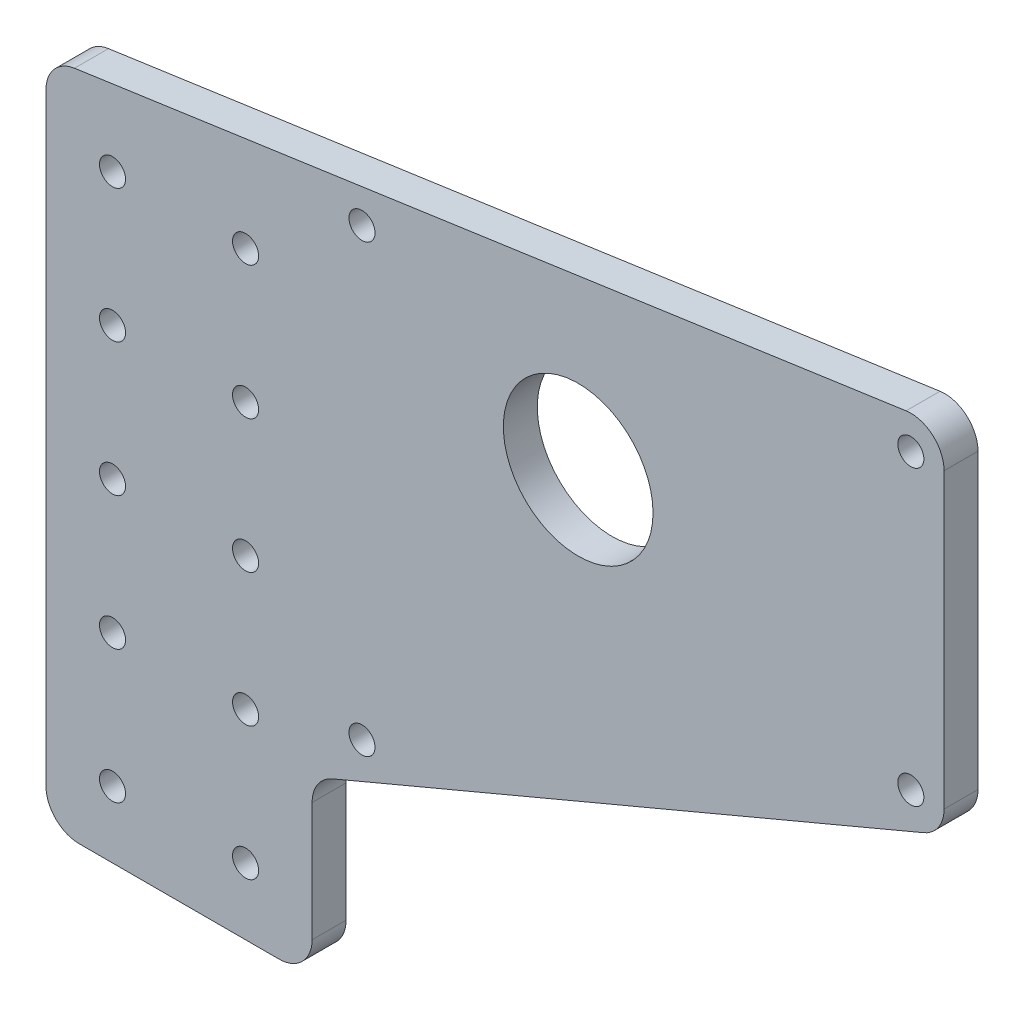
ISO-10303-21;
HEADER;
FILE_DESCRIPTION(('STEP AP214'),'2;1');
FILE_NAME('part.step','',(''),(''),'','','');
FILE_SCHEMA(('AUTOMOTIVE_DESIGN { 1 0 10303 214 1 1 1 1 }'));
ENDSEC;
DATA;
#1=APPLICATION_CONTEXT('core data for automotive mechanical design processes');
#2=APPLICATION_PROTOCOL_DEFINITION('international standard','automotive_design',2000,#1);
#3=PRODUCT_CONTEXT('',#1,'mechanical');
#4=PRODUCT('Part','Part','',(#3));
#5=PRODUCT_RELATED_PRODUCT_CATEGORY('part','',(#4));
#6=PRODUCT_DEFINITION_FORMATION('','',#4);
#7=PRODUCT_DEFINITION_CONTEXT('part definition',#1,'design');
#8=PRODUCT_DEFINITION('design','',#6,#7);
#9=PRODUCT_DEFINITION_SHAPE('','',#8);
#10=(LENGTH_UNIT() NAMED_UNIT(*) SI_UNIT(.MILLI.,.METRE.));
#11=(NAMED_UNIT(*) PLANE_ANGLE_UNIT() SI_UNIT($,.RADIAN.));
#12=(NAMED_UNIT(*) SI_UNIT($,.STERADIAN.) SOLID_ANGLE_UNIT());
#13=UNCERTAINTY_MEASURE_WITH_UNIT(LENGTH_MEASURE(1.E-05),#10,'distance_accuracy_value','');
#14=(GEOMETRIC_REPRESENTATION_CONTEXT(3) GLOBAL_UNCERTAINTY_ASSIGNED_CONTEXT((#13)) GLOBAL_UNIT_ASSIGNED_CONTEXT((#10,
#11,#12)) REPRESENTATION_CONTEXT('',''));
#15=CARTESIAN_POINT('',(0.,0.,0.));
#16=DIRECTION('',(0.,0.,1.));
#17=DIRECTION('',(1.,0.,0.));
#18=AXIS2_PLACEMENT_3D('',#15,#16,#17);
#19=CARTESIAN_POINT('',(482.6,0.,6.477));
#20=DIRECTION('',(1.,0.,0.));
#21=DIRECTION('',(0.,0.,-1.));
#22=AXIS2_PLACEMENT_3D('',#19,#20,#21);
#23=PLANE('',#22);
#24=DIRECTION('',(0.,-1.,0.));
#25=VECTOR('',#24,1.);
#26=CARTESIAN_POINT('',(482.6,0.,6.477));
#27=LINE('',#26,#25);
#28=CARTESIAN_POINT('',(482.6,621.620473744719,6.477));
#29=VERTEX_POINT('',#28);
#30=CARTESIAN_POINT('',(482.6,506.476,6.477));
#31=VERTEX_POINT('',#30);
#32=EDGE_CURVE('E152',#29,#31,#27,.T.);
#33=ORIENTED_EDGE('',*,*,#32,.F.);
#34=DIRECTION('',(0.,0.,-1.));
#35=VECTOR('',#34,1.);
#36=CARTESIAN_POINT('',(482.6,621.620473744719,0.));
#37=LINE('',#36,#35);
#38=CARTESIAN_POINT('',(482.6,621.620473744719,0.));
#39=VERTEX_POINT('',#38);
#40=EDGE_CURVE('E137',#29,#39,#37,.T.);
#41=ORIENTED_EDGE('',*,*,#40,.T.);
#42=DIRECTION('',(0.,-1.,0.));
#43=VECTOR('',#42,1.);
#44=CARTESIAN_POINT('',(482.6,0.,0.));
#45=LINE('',#44,#43);
#46=CARTESIAN_POINT('',(482.6,506.476,0.));
#47=VERTEX_POINT('',#46);
#48=EDGE_CURVE('E149',#39,#47,#45,.T.);
#49=ORIENTED_EDGE('',*,*,#48,.T.);
#50=DIRECTION('',(0.,0.,-1.));
#51=VECTOR('',#50,1.);
#52=CARTESIAN_POINT('',(482.6,506.476,6.477));
#53=LINE('',#52,#51);
#54=EDGE_CURVE('E154',#47,#31,#53,.F.);
#55=ORIENTED_EDGE('',*,*,#54,.T.);
#56=EDGE_LOOP('',(#33,#41,#49,#55));
#57=FACE_BOUND('',#56,.T.);
#58=ADVANCED_FACE('F43',(#57),#23,.F.);
#59=CARTESIAN_POINT('',(0.,500.126,6.477));
#60=DIRECTION('',(0.,1.,0.));
#61=DIRECTION('',(0.,0.,1.));
#62=AXIS2_PLACEMENT_3D('',#59,#60,#61);
#63=PLANE('',#62);
#64=DIRECTION('',(1.,0.,0.));
#65=VECTOR('',#64,1.);
#66=CARTESIAN_POINT('',(0.,500.126,6.477));
#67=LINE('',#66,#65);
#68=CARTESIAN_POINT('',(488.95,500.126,6.477));
#69=VERTEX_POINT('',#68);
#70=CARTESIAN_POINT('',(527.05,500.126,6.477));
#71=VERTEX_POINT('',#70);
#72=EDGE_CURVE('E239',#69,#71,#67,.T.);
#73=ORIENTED_EDGE('',*,*,#72,.F.);
#74=DIRECTION('',(0.,0.,-1.));
#75=VECTOR('',#74,1.);
#76=CARTESIAN_POINT('',(488.95,500.126,6.477));
#77=LINE('',#76,#75);
#78=CARTESIAN_POINT('',(488.95,500.126,0.));
#79=VERTEX_POINT('',#78);
#80=EDGE_CURVE('E211',#69,#79,#77,.T.);
#81=ORIENTED_EDGE('',*,*,#80,.T.);
#82=DIRECTION('',(1.,0.,0.));
#83=VECTOR('',#82,1.);
#84=CARTESIAN_POINT('',(0.,500.126,0.));
#85=LINE('',#84,#83);
#86=CARTESIAN_POINT('',(527.05,500.126,0.));
#87=VERTEX_POINT('',#86);
#88=EDGE_CURVE('E159',#79,#87,#85,.T.);
#89=ORIENTED_EDGE('',*,*,#88,.T.);
#90=DIRECTION('',(0.,0.,-1.));
#91=VECTOR('',#90,1.);
#92=CARTESIAN_POINT('',(527.05,500.126,6.477));
#93=LINE('',#92,#91);
#94=EDGE_CURVE('E209',#87,#71,#93,.F.);
#95=ORIENTED_EDGE('',*,*,#94,.T.);
#96=EDGE_LOOP('',(#73,#81,#89,#95));
#97=FACE_BOUND('',#96,.T.);
#98=ADVANCED_FACE('F351',(#97),#63,.F.);
#99=CARTESIAN_POINT('',(533.4,0.,6.477));
#100=DIRECTION('',(1.,0.,0.));
#101=DIRECTION('',(0.,0.,-1.));
#102=AXIS2_PLACEMENT_3D('',#99,#100,#101);
#103=PLANE('',#102);
#104=DIRECTION('',(0.,-1.,0.));
#105=VECTOR('',#104,1.);
#106=CARTESIAN_POINT('',(533.4,0.,6.477));
#107=LINE('',#106,#105);
#108=CARTESIAN_POINT('',(533.4,529.183757704627,6.477));
#109=VERTEX_POINT('',#108);
#110=CARTESIAN_POINT('',(533.4,506.476,6.477));
#111=VERTEX_POINT('',#110);
#112=EDGE_CURVE('E233',#109,#111,#107,.T.);
#113=ORIENTED_EDGE('',*,*,#112,.T.);
#114=DIRECTION('',(0.,0.,-1.));
#115=VECTOR('',#114,1.);
#116=CARTESIAN_POINT('',(533.4,506.476,0.));
#117=LINE('',#116,#115);
#118=CARTESIAN_POINT('',(533.4,506.476,0.));
#119=VERTEX_POINT('',#118);
#120=EDGE_CURVE('E216',#111,#119,#117,.T.);
#121=ORIENTED_EDGE('',*,*,#120,.T.);
#122=DIRECTION('',(0.,-1.,0.));
#123=VECTOR('',#122,1.);
#124=CARTESIAN_POINT('',(533.4,0.,0.));
#125=LINE('',#124,#123);
#126=CARTESIAN_POINT('',(533.4,529.183757704627,0.));
#127=VERTEX_POINT('',#126);
#128=EDGE_CURVE('E163',#127,#119,#125,.T.);
#129=ORIENTED_EDGE('',*,*,#128,.F.);
#130=DIRECTION('',(0.,0.,-1.));
#131=VECTOR('',#130,1.);
#132=CARTESIAN_POINT('',(533.4,529.183757704627,6.477));
#133=LINE('',#132,#131);
#134=EDGE_CURVE('E214',#127,#109,#133,.F.);
#135=ORIENTED_EDGE('',*,*,#134,.T.);
#136=EDGE_LOOP('',(#113,#121,#129,#135));
#137=FACE_BOUND('',#136,.T.);
#138=ADVANCED_FACE('F225',(#137),#103,.T.);
#139=CARTESIAN_POINT('',(-110.445176470612,262.307294117703,6.477));
#140=DIRECTION('',(0.388057000058133,-0.921635375138065,0.));
#141=DIRECTION('',(0.921635375138065,0.388057000058133,0.));
#142=AXIS2_PLACEMENT_3D('',#139,#140,#141);
#143=PLANE('',#142);
#144=DIRECTION('',(-0.921635375138065,-0.388057000058133,0.));
#145=VECTOR('',#144,1.);
#146=CARTESIAN_POINT('',(-110.445176470612,262.307294117703,0.));
#147=LINE('',#146,#145);
#148=CARTESIAN_POINT('',(650.164161950369,582.56385766338,0.));
#149=VERTEX_POINT('',#148);
#150=CARTESIAN_POINT('',(537.285838049631,535.036142336753,0.));
#151=VERTEX_POINT('',#150);
#152=EDGE_CURVE('E174',#149,#151,#147,.T.);
#153=ORIENTED_EDGE('',*,*,#152,.F.);
#154=DIRECTION('',(0.,0.,-1.));
#155=VECTOR('',#154,1.);
#156=CARTESIAN_POINT('',(650.164161950369,582.56385766338,6.477));
#157=LINE('',#156,#155);
#158=CARTESIAN_POINT('',(650.164161950369,582.56385766338,6.477));
#159=VERTEX_POINT('',#158);
#160=EDGE_CURVE('E207',#149,#159,#157,.F.);
#161=ORIENTED_EDGE('',*,*,#160,.T.);
#162=DIRECTION('',(-0.921635375138065,-0.388057000058133,0.));
#163=VECTOR('',#162,1.);
#164=CARTESIAN_POINT('',(-110.445176470612,262.307294117703,6.477));
#165=LINE('',#164,#163);
#166=CARTESIAN_POINT('',(537.285838049631,535.036142336753,6.477));
#167=VERTEX_POINT('',#166);
#168=EDGE_CURVE('E232',#159,#167,#165,.T.);
#169=ORIENTED_EDGE('',*,*,#168,.T.);
#170=DIRECTION('',(0.,0.,-1.));
#171=VECTOR('',#170,1.);
#172=CARTESIAN_POINT('',(537.285838049631,535.036142336753,0.));
#173=LINE('',#172,#171);
#174=EDGE_CURVE('E204',#167,#151,#173,.T.);
#175=ORIENTED_EDGE('',*,*,#174,.T.);
#176=EDGE_LOOP('',(#153,#161,#169,#175));
#177=FACE_BOUND('',#176,.T.);
#178=ADVANCED_FACE('F235',(#177),#143,.T.);
#179=CARTESIAN_POINT('',(654.05,0.,6.477));
#180=DIRECTION('',(1.,0.,0.));
#181=DIRECTION('',(0.,0.,-1.));
#182=AXIS2_PLACEMENT_3D('',#179,#180,#181);
#183=PLANE('',#182);
#184=DIRECTION('',(0.,-1.,0.));
#185=VECTOR('',#184,1.);
#186=CARTESIAN_POINT('',(654.05,0.,0.));
#187=LINE('',#186,#185);
#188=CARTESIAN_POINT('',(654.05,644.351453918517,0.));
#189=VERTEX_POINT('',#188);
#190=CARTESIAN_POINT('',(654.05,588.416242295507,0.));
#191=VERTEX_POINT('',#190);
#192=EDGE_CURVE('E177',#189,#191,#187,.T.);
#193=ORIENTED_EDGE('',*,*,#192,.F.);
#194=DIRECTION('',(0.,0.,-1.));
#195=VECTOR('',#194,1.);
#196=CARTESIAN_POINT('',(654.05,644.351453918517,6.477));
#197=LINE('',#196,#195);
#198=CARTESIAN_POINT('',(654.05,644.351453918517,6.477));
#199=VERTEX_POINT('',#198);
#200=EDGE_CURVE('E65',#189,#199,#197,.F.);
#201=ORIENTED_EDGE('',*,*,#200,.T.);
#202=DIRECTION('',(0.,-1.,0.));
#203=VECTOR('',#202,1.);
#204=CARTESIAN_POINT('',(654.05,0.,6.477));
#205=LINE('',#204,#203);
#206=CARTESIAN_POINT('',(654.05,588.416242295507,6.477));
#207=VERTEX_POINT('',#206);
#208=EDGE_CURVE('E237',#199,#207,#205,.T.);
#209=ORIENTED_EDGE('',*,*,#208,.T.);
#210=DIRECTION('',(0.,0.,-1.));
#211=VECTOR('',#210,1.);
#212=CARTESIAN_POINT('',(654.05,588.416242295507,6.477));
#213=LINE('',#212,#211);
#214=EDGE_CURVE('E200',#207,#191,#213,.T.);
#215=ORIENTED_EDGE('',*,*,#214,.T.);
#216=EDGE_LOOP('',(#193,#201,#209,#215));
#217=FACE_BOUND('',#216,.T.);
#218=ADVANCED_FACE('F390',(#217),#183,.T.);
#219=CARTESIAN_POINT('',(-78.2966270222328,546.812739474692,6.477));
#220=DIRECTION('',(-0.141741613517293,0.989903689758511,0.));
#221=DIRECTION('',(-0.989903689758511,-0.141741613517293,0.));
#222=AXIS2_PLACEMENT_3D('',#219,#220,#221);
#223=PLANE('',#222);
#224=DIRECTION('',(0.989903689758511,0.141741613517293,0.));
#225=VECTOR('',#224,1.);
#226=CARTESIAN_POINT('',(-78.2966270222328,546.812739474692,0.));
#227=LINE('',#226,#225);
#228=CARTESIAN_POINT('',(488.049940754166,627.906362174685,0.));
#229=VERTEX_POINT('',#228);
#230=CARTESIAN_POINT('',(646.799940754166,650.637342348483,0.));
#231=VERTEX_POINT('',#230);
#232=EDGE_CURVE('E180',#229,#231,#227,.T.);
#233=ORIENTED_EDGE('',*,*,#232,.F.);
#234=DIRECTION('',(0.,0.,-1.));
#235=VECTOR('',#234,1.);
#236=CARTESIAN_POINT('',(488.049940754165,627.906362174685,6.477));
#237=LINE('',#236,#235);
#238=CARTESIAN_POINT('',(488.049940754166,627.906362174685,6.477));
#239=VERTEX_POINT('',#238);
#240=EDGE_CURVE('E138',#229,#239,#237,.F.);
#241=ORIENTED_EDGE('',*,*,#240,.T.);
#242=DIRECTION('',(0.989903689758511,0.141741613517293,0.));
#243=VECTOR('',#242,1.);
#244=CARTESIAN_POINT('',(-78.2966270222328,546.812739474692,6.477));
#245=LINE('',#244,#243);
#246=CARTESIAN_POINT('',(646.799940754166,650.637342348483,6.477));
#247=VERTEX_POINT('',#246);
#248=EDGE_CURVE('E169',#239,#247,#245,.T.);
#249=ORIENTED_EDGE('',*,*,#248,.T.);
#250=DIRECTION('',(0.,0.,-1.));
#251=VECTOR('',#250,1.);
#252=CARTESIAN_POINT('',(646.799940754165,650.637342348483,6.477));
#253=LINE('',#252,#251);
#254=EDGE_CURVE('E143',#247,#231,#253,.T.);
#255=ORIENTED_EDGE('',*,*,#254,.T.);
#256=EDGE_LOOP('',(#233,#241,#249,#255));
#257=FACE_BOUND('',#256,.T.);
#258=ADVANCED_FACE('F389',(#257),#223,.T.);
#259=CARTESIAN_POINT('',(0.,0.,6.477));
#260=DIRECTION('',(0.,0.,1.));
#261=DIRECTION('',(1.,0.,0.));
#262=AXIS2_PLACEMENT_3D('',#259,#260,#261);
#263=PLANE('',#262);
#264=CARTESIAN_POINT('',(542.925,544.300452821823,6.477));
#265=DIRECTION('',(0.,0.,1.));
#266=DIRECTION('',(1.,0.,0.));
#267=AXIS2_PLACEMENT_3D('',#264,#265,#266);
#268=CIRCLE('',#267,2.48919999999994);
#269=CARTESIAN_POINT('',(545.4142,544.300452821823,6.477));
#270=VERTEX_POINT('',#269);
#271=EDGE_CURVE('E279',#270,#270,#268,.T.);
#272=ORIENTED_EDGE('',*,*,#271,.F.);
#273=EDGE_LOOP('',(#272));
#274=FACE_BOUND('',#273,.T.);
#275=CARTESIAN_POINT('',(495.300000000001,538.226,6.477));
#276=DIRECTION('',(0.,0.,1.));
#277=DIRECTION('',(1.,0.,0.));
#278=AXIS2_PLACEMENT_3D('',#275,#276,#277);
#279=CIRCLE('',#278,2.48920000000002);
#280=CARTESIAN_POINT('',(497.789200000001,538.226,6.477));
#281=VERTEX_POINT('',#280);
#282=EDGE_CURVE('E272',#281,#281,#279,.T.);
#283=ORIENTED_EDGE('',*,*,#282,.F.);
#284=EDGE_LOOP('',(#283));
#285=FACE_BOUND('',#284,.T.);
#286=CARTESIAN_POINT('',(520.700000000001,538.226,6.477));
#287=DIRECTION('',(0.,0.,1.));
#288=DIRECTION('',(1.,0.,0.));
#289=AXIS2_PLACEMENT_3D('',#286,#287,#288);
#290=CIRCLE('',#289,2.48920000000008);
#291=CARTESIAN_POINT('',(523.189200000001,538.226,6.477));
#292=VERTEX_POINT('',#291);
#293=EDGE_CURVE('E291',#292,#292,#290,.T.);
#294=ORIENTED_EDGE('',*,*,#293,.F.);
#295=EDGE_LOOP('',(#294));
#296=FACE_BOUND('',#295,.T.);
#297=CARTESIAN_POINT('',(520.7,614.426,6.477));
#298=DIRECTION('',(0.,0.,1.));
#299=DIRECTION('',(1.,0.,0.));
#300=AXIS2_PLACEMENT_3D('',#297,#298,#299);
#301=CIRCLE('',#300,2.48920000000004);
#302=CARTESIAN_POINT('',(523.1892,614.426,6.477));
#303=VERTEX_POINT('',#302);
#304=EDGE_CURVE('E284',#303,#303,#301,.T.);
#305=ORIENTED_EDGE('',*,*,#304,.F.);
#306=EDGE_LOOP('',(#305));
#307=FACE_BOUND('',#306,.T.);
#308=CARTESIAN_POINT('',(647.7,588.416242295507,6.477));
#309=DIRECTION('',(0.,0.,1.));
#310=DIRECTION('',(1.,0.,0.));
#311=AXIS2_PLACEMENT_3D('',#308,#309,#310);
#312=CIRCLE('',#311,2.48919999999994);
#313=CARTESIAN_POINT('',(650.1892,588.416242295507,6.477));
#314=VERTEX_POINT('',#313);
#315=EDGE_CURVE('E248',#314,#314,#312,.T.);
#316=ORIENTED_EDGE('',*,*,#315,.F.);
#317=EDGE_LOOP('',(#316));
#318=FACE_BOUND('',#317,.T.);
#319=CARTESIAN_POINT('',(647.7,644.351453918517,6.477));
#320=DIRECTION('',(0.,0.,1.));
#321=DIRECTION('',(1.,0.,0.));
#322=AXIS2_PLACEMENT_3D('',#319,#320,#321);
#323=CIRCLE('',#322,2.48919999999994);
#324=CARTESIAN_POINT('',(650.1892,644.351453918517,6.477));
#325=VERTEX_POINT('',#324);
#326=EDGE_CURVE('E255',#325,#325,#323,.T.);
#327=ORIENTED_EDGE('',*,*,#326,.F.);
#328=EDGE_LOOP('',(#327));
#329=FACE_BOUND('',#328,.T.);
#330=CARTESIAN_POINT('',(584.20000000001,609.600000000067,6.477));
#331=DIRECTION('',(0.,0.,1.));
#332=DIRECTION('',(1.,0.,0.));
#333=AXIS2_PLACEMENT_3D('',#330,#331,#332);
#334=CIRCLE('',#333,14.2875000000112);
#335=CARTESIAN_POINT('',(598.487500000021,609.600000000067,6.477));
#336=VERTEX_POINT('',#335);
#337=EDGE_CURVE('E261',#336,#336,#334,.T.);
#338=ORIENTED_EDGE('',*,*,#337,.F.);
#339=EDGE_LOOP('',(#338));
#340=FACE_BOUND('',#339,.T.);
#341=CARTESIAN_POINT('',(520.7,512.826,6.477));
#342=DIRECTION('',(0.,0.,1.));
#343=DIRECTION('',(1.,0.,0.));
#344=AXIS2_PLACEMENT_3D('',#341,#342,#343);
#345=CIRCLE('',#344,2.48920000000004);
#346=CARTESIAN_POINT('',(523.1892,512.826,6.477));
#347=VERTEX_POINT('',#346);
#348=EDGE_CURVE('E267',#347,#347,#345,.T.);
#349=ORIENTED_EDGE('',*,*,#348,.F.);
#350=EDGE_LOOP('',(#349));
#351=FACE_BOUND('',#350,.T.);
#352=CARTESIAN_POINT('',(542.925,629.34900700381,6.477));
#353=DIRECTION('',(0.,0.,1.));
#354=DIRECTION('',(1.,0.,0.));
#355=AXIS2_PLACEMENT_3D('',#352,#353,#354);
#356=CIRCLE('',#355,2.48919999999994);
#357=CARTESIAN_POINT('',(545.4142,629.34900700381,6.477));
#358=VERTEX_POINT('',#357);
#359=EDGE_CURVE('E320',#358,#358,#356,.T.);
#360=ORIENTED_EDGE('',*,*,#359,.F.);
#361=EDGE_LOOP('',(#360));
#362=FACE_BOUND('',#361,.T.);
#363=CARTESIAN_POINT('',(520.700000000001,563.626,6.477));
#364=DIRECTION('',(0.,0.,1.));
#365=DIRECTION('',(1.,0.,0.));
#366=AXIS2_PLACEMENT_3D('',#363,#364,#365);
#367=CIRCLE('',#366,2.48919999999994);
#368=CARTESIAN_POINT('',(523.189200000001,563.626,6.477));
#369=VERTEX_POINT('',#368);
#370=EDGE_CURVE('E326',#369,#369,#367,.T.);
#371=ORIENTED_EDGE('',*,*,#370,.F.);
#372=EDGE_LOOP('',(#371));
#373=FACE_BOUND('',#372,.T.);
#374=CARTESIAN_POINT('',(495.3,614.426,6.477));
#375=DIRECTION('',(0.,0.,1.));
#376=DIRECTION('',(1.,0.,0.));
#377=AXIS2_PLACEMENT_3D('',#374,#375,#376);
#378=CIRCLE('',#377,2.48919999999999);
#379=CARTESIAN_POINT('',(497.7892,614.426,6.477));
#380=VERTEX_POINT('',#379);
#381=EDGE_CURVE('E303',#380,#380,#378,.T.);
#382=ORIENTED_EDGE('',*,*,#381,.F.);
#383=EDGE_LOOP('',(#382));
#384=FACE_BOUND('',#383,.T.);
#385=CARTESIAN_POINT('',(495.3,589.026,6.477));
#386=DIRECTION('',(0.,0.,1.));
#387=DIRECTION('',(1.,0.,0.));
#388=AXIS2_PLACEMENT_3D('',#385,#386,#387);
#389=CIRCLE('',#388,2.48919999999999);
#390=CARTESIAN_POINT('',(497.7892,589.026,6.477));
#391=VERTEX_POINT('',#390);
#392=EDGE_CURVE('E296',#391,#391,#389,.T.);
#393=ORIENTED_EDGE('',*,*,#392,.F.);
#394=EDGE_LOOP('',(#393));
#395=FACE_BOUND('',#394,.T.);
#396=CARTESIAN_POINT('',(520.7,589.026,6.477));
#397=DIRECTION('',(0.,0.,1.));
#398=DIRECTION('',(1.,0.,0.));
#399=AXIS2_PLACEMENT_3D('',#396,#397,#398);
#400=CIRCLE('',#399,2.48919999999994);
#401=CARTESIAN_POINT('',(523.1892,589.026,6.477));
#402=VERTEX_POINT('',#401);
#403=EDGE_CURVE('E315',#402,#402,#400,.T.);
#404=ORIENTED_EDGE('',*,*,#403,.F.);
#405=EDGE_LOOP('',(#404));
#406=FACE_BOUND('',#405,.T.);
#407=CARTESIAN_POINT('',(495.300000000001,563.626,6.477));
#408=DIRECTION('',(0.,0.,1.));
#409=DIRECTION('',(1.,0.,0.));
#410=AXIS2_PLACEMENT_3D('',#407,#408,#409);
#411=CIRCLE('',#410,2.48919999999999);
#412=CARTESIAN_POINT('',(497.789200000001,563.626,6.477));
#413=VERTEX_POINT('',#412);
#414=EDGE_CURVE('E308',#413,#413,#411,.T.);
#415=ORIENTED_EDGE('',*,*,#414,.F.);
#416=EDGE_LOOP('',(#415));
#417=FACE_BOUND('',#416,.T.);
#418=CARTESIAN_POINT('',(495.3,512.826,6.477));
#419=DIRECTION('',(0.,0.,1.));
#420=DIRECTION('',(1.,0.,0.));
#421=AXIS2_PLACEMENT_3D('',#418,#419,#420);
#422=CIRCLE('',#421,2.48919999999999);
#423=CARTESIAN_POINT('',(497.7892,512.826,6.477));
#424=VERTEX_POINT('',#423);
#425=EDGE_CURVE('E160',#424,#424,#422,.T.);
#426=ORIENTED_EDGE('',*,*,#425,.F.);
#427=EDGE_LOOP('',(#426));
#428=FACE_BOUND('',#427,.T.);
#429=ORIENTED_EDGE('',*,*,#248,.F.);
#430=CARTESIAN_POINT('',(488.95,621.620473744719,6.477));
#431=DIRECTION('',(0.,0.,1.));
#432=DIRECTION('',(1.,0.,0.));
#433=AXIS2_PLACEMENT_3D('',#430,#431,#432);
#434=CIRCLE('',#433,6.35);
#435=EDGE_CURVE('E198',#239,#29,#434,.T.);
#436=ORIENTED_EDGE('',*,*,#435,.T.);
#437=ORIENTED_EDGE('',*,*,#32,.T.);
#438=CARTESIAN_POINT('',(488.95,506.476,6.477));
#439=DIRECTION('',(0.,0.,1.));
#440=DIRECTION('',(1.,0.,0.));
#441=AXIS2_PLACEMENT_3D('',#438,#439,#440);
#442=CIRCLE('',#441,6.35);
#443=EDGE_CURVE('E193',#31,#69,#442,.T.);
#444=ORIENTED_EDGE('',*,*,#443,.T.);
#445=ORIENTED_EDGE('',*,*,#72,.T.);
#446=CARTESIAN_POINT('',(527.05,506.476,6.477));
#447=DIRECTION('',(0.,0.,1.));
#448=DIRECTION('',(1.,0.,0.));
#449=AXIS2_PLACEMENT_3D('',#446,#447,#448);
#450=CIRCLE('',#449,6.35);
#451=EDGE_CURVE('E191',#71,#111,#450,.T.);
#452=ORIENTED_EDGE('',*,*,#451,.T.);
#453=ORIENTED_EDGE('',*,*,#112,.F.);
#454=CARTESIAN_POINT('',(539.75,529.183757704627,6.477));
#455=DIRECTION('',(0.,0.,1.));
#456=DIRECTION('',(1.,0.,0.));
#457=AXIS2_PLACEMENT_3D('',#454,#455,#456);
#458=CIRCLE('',#457,6.35);
#459=EDGE_CURVE('E11',#109,#167,#458,.F.);
#460=ORIENTED_EDGE('',*,*,#459,.T.);
#461=ORIENTED_EDGE('',*,*,#168,.F.);
#462=CARTESIAN_POINT('',(647.7,588.416242295507,6.477));
#463=DIRECTION('',(0.,0.,1.));
#464=DIRECTION('',(1.,0.,0.));
#465=AXIS2_PLACEMENT_3D('',#462,#463,#464);
#466=CIRCLE('',#465,6.35);
#467=EDGE_CURVE('E58',#159,#207,#466,.T.);
#468=ORIENTED_EDGE('',*,*,#467,.T.);
#469=ORIENTED_EDGE('',*,*,#208,.F.);
#470=CARTESIAN_POINT('',(647.7,644.351453918517,6.477));
#471=DIRECTION('',(0.,0.,1.));
#472=DIRECTION('',(1.,0.,0.));
#473=AXIS2_PLACEMENT_3D('',#470,#471,#472);
#474=CIRCLE('',#473,6.35);
#475=EDGE_CURVE('E196',#199,#247,#474,.T.);
#476=ORIENTED_EDGE('',*,*,#475,.T.);
#477=EDGE_LOOP('',(#429,#436,#437,#444,#445,#452,#453,#460,#461,#468,#469,#476));
#478=FACE_BOUND('',#477,.T.);
#479=ADVANCED_FACE('F231',(#274,#285,#296,#307,#318,#329,#340,#351,#362,#373,#384,#395,#406,
#417,#428,#478),#263,.T.);
#480=CARTESIAN_POINT('',(0.,0.,0.));
#481=DIRECTION('',(0.,0.,1.));
#482=DIRECTION('',(1.,0.,0.));
#483=AXIS2_PLACEMENT_3D('',#480,#481,#482);
#484=PLANE('',#483);
#485=CARTESIAN_POINT('',(542.925,544.300452821823,0.));
#486=DIRECTION('',(0.,0.,1.));
#487=DIRECTION('',(1.,0.,0.));
#488=AXIS2_PLACEMENT_3D('',#485,#486,#487);
#489=CIRCLE('',#488,2.48919999999994);
#490=CARTESIAN_POINT('',(545.4142,544.300452821823,0.));
#491=VERTEX_POINT('',#490);
#492=EDGE_CURVE('E252',#491,#491,#489,.T.);
#493=ORIENTED_EDGE('',*,*,#492,.T.);
#494=EDGE_LOOP('',(#493));
#495=FACE_BOUND('',#494,.T.);
#496=CARTESIAN_POINT('',(495.300000000001,538.226,0.));
#497=DIRECTION('',(0.,0.,1.));
#498=DIRECTION('',(1.,0.,0.));
#499=AXIS2_PLACEMENT_3D('',#496,#497,#498);
#500=CIRCLE('',#499,2.48920000000002);
#501=CARTESIAN_POINT('',(497.789200000001,538.226,0.));
#502=VERTEX_POINT('',#501);
#503=EDGE_CURVE('E275',#502,#502,#500,.T.);
#504=ORIENTED_EDGE('',*,*,#503,.T.);
#505=EDGE_LOOP('',(#504));
#506=FACE_BOUND('',#505,.T.);
#507=CARTESIAN_POINT('',(520.700000000001,538.226,0.));
#508=DIRECTION('',(0.,0.,1.));
#509=DIRECTION('',(1.,0.,0.));
#510=AXIS2_PLACEMENT_3D('',#507,#508,#509);
#511=CIRCLE('',#510,2.48920000000008);
#512=CARTESIAN_POINT('',(523.189200000001,538.226,0.));
#513=VERTEX_POINT('',#512);
#514=EDGE_CURVE('E276',#513,#513,#511,.T.);
#515=ORIENTED_EDGE('',*,*,#514,.T.);
#516=EDGE_LOOP('',(#515));
#517=FACE_BOUND('',#516,.T.);
#518=CARTESIAN_POINT('',(520.7,614.426,0.));
#519=DIRECTION('',(0.,0.,1.));
#520=DIRECTION('',(1.,0.,0.));
#521=AXIS2_PLACEMENT_3D('',#518,#519,#520);
#522=CIRCLE('',#521,2.48920000000004);
#523=CARTESIAN_POINT('',(523.1892,614.426,0.));
#524=VERTEX_POINT('',#523);
#525=EDGE_CURVE('E287',#524,#524,#522,.T.);
#526=ORIENTED_EDGE('',*,*,#525,.T.);
#527=EDGE_LOOP('',(#526));
#528=FACE_BOUND('',#527,.T.);
#529=CARTESIAN_POINT('',(647.7,588.416242295507,0.));
#530=DIRECTION('',(0.,0.,1.));
#531=DIRECTION('',(1.,0.,0.));
#532=AXIS2_PLACEMENT_3D('',#529,#530,#531);
#533=CIRCLE('',#532,2.48919999999994);
#534=CARTESIAN_POINT('',(650.1892,588.416242295507,0.));
#535=VERTEX_POINT('',#534);
#536=EDGE_CURVE('E251',#535,#535,#533,.T.);
#537=ORIENTED_EDGE('',*,*,#536,.T.);
#538=EDGE_LOOP('',(#537));
#539=FACE_BOUND('',#538,.T.);
#540=CARTESIAN_POINT('',(647.7,644.351453918517,0.));
#541=DIRECTION('',(0.,0.,1.));
#542=DIRECTION('',(1.,0.,0.));
#543=AXIS2_PLACEMENT_3D('',#540,#541,#542);
#544=CIRCLE('',#543,2.48919999999994);
#545=CARTESIAN_POINT('',(650.1892,644.351453918517,0.));
#546=VERTEX_POINT('',#545);
#547=EDGE_CURVE('E258',#546,#546,#544,.T.);
#548=ORIENTED_EDGE('',*,*,#547,.T.);
#549=EDGE_LOOP('',(#548));
#550=FACE_BOUND('',#549,.T.);
#551=CARTESIAN_POINT('',(584.20000000001,609.600000000067,0.));
#552=DIRECTION('',(0.,0.,1.));
#553=DIRECTION('',(1.,0.,0.));
#554=AXIS2_PLACEMENT_3D('',#551,#552,#553);
#555=CIRCLE('',#554,14.2875000000112);
#556=CARTESIAN_POINT('',(598.487500000021,609.600000000067,0.));
#557=VERTEX_POINT('',#556);
#558=EDGE_CURVE('E264',#557,#557,#555,.T.);
#559=ORIENTED_EDGE('',*,*,#558,.T.);
#560=EDGE_LOOP('',(#559));
#561=FACE_BOUND('',#560,.T.);
#562=CARTESIAN_POINT('',(520.7,512.826,0.));
#563=DIRECTION('',(0.,0.,1.));
#564=DIRECTION('',(1.,0.,0.));
#565=AXIS2_PLACEMENT_3D('',#562,#563,#564);
#566=CIRCLE('',#565,2.48920000000004);
#567=CARTESIAN_POINT('',(523.1892,512.826,0.));
#568=VERTEX_POINT('',#567);
#569=EDGE_CURVE('E246',#568,#568,#566,.T.);
#570=ORIENTED_EDGE('',*,*,#569,.T.);
#571=EDGE_LOOP('',(#570));
#572=FACE_BOUND('',#571,.T.);
#573=CARTESIAN_POINT('',(542.925,629.34900700381,0.));
#574=DIRECTION('',(0.,0.,1.));
#575=DIRECTION('',(1.,0.,0.));
#576=AXIS2_PLACEMENT_3D('',#573,#574,#575);
#577=CIRCLE('',#576,2.48919999999994);
#578=CARTESIAN_POINT('',(545.4142,629.34900700381,0.));
#579=VERTEX_POINT('',#578);
#580=EDGE_CURVE('E323',#579,#579,#577,.T.);
#581=ORIENTED_EDGE('',*,*,#580,.T.);
#582=EDGE_LOOP('',(#581));
#583=FACE_BOUND('',#582,.T.);
#584=CARTESIAN_POINT('',(520.700000000001,563.626,0.));
#585=DIRECTION('',(0.,0.,1.));
#586=DIRECTION('',(1.,0.,0.));
#587=AXIS2_PLACEMENT_3D('',#584,#585,#586);
#588=CIRCLE('',#587,2.48919999999994);
#589=CARTESIAN_POINT('',(523.189200000001,563.626,0.));
#590=VERTEX_POINT('',#589);
#591=EDGE_CURVE('E312',#590,#590,#588,.T.);
#592=ORIENTED_EDGE('',*,*,#591,.T.);
#593=EDGE_LOOP('',(#592));
#594=FACE_BOUND('',#593,.T.);
#595=CARTESIAN_POINT('',(495.3,614.426,0.));
#596=DIRECTION('',(0.,0.,1.));
#597=DIRECTION('',(1.,0.,0.));
#598=AXIS2_PLACEMENT_3D('',#595,#596,#597);
#599=CIRCLE('',#598,2.48919999999999);
#600=CARTESIAN_POINT('',(497.7892,614.426,0.));
#601=VERTEX_POINT('',#600);
#602=EDGE_CURVE('E288',#601,#601,#599,.T.);
#603=ORIENTED_EDGE('',*,*,#602,.T.);
#604=EDGE_LOOP('',(#603));
#605=FACE_BOUND('',#604,.T.);
#606=CARTESIAN_POINT('',(495.3,589.026,0.));
#607=DIRECTION('',(0.,0.,1.));
#608=DIRECTION('',(1.,0.,0.));
#609=AXIS2_PLACEMENT_3D('',#606,#607,#608);
#610=CIRCLE('',#609,2.48919999999999);
#611=CARTESIAN_POINT('',(497.7892,589.026,0.));
#612=VERTEX_POINT('',#611);
#613=EDGE_CURVE('E299',#612,#612,#610,.T.);
#614=ORIENTED_EDGE('',*,*,#613,.T.);
#615=EDGE_LOOP('',(#614));
#616=FACE_BOUND('',#615,.T.);
#617=CARTESIAN_POINT('',(520.7,589.026,0.));
#618=DIRECTION('',(0.,0.,1.));
#619=DIRECTION('',(1.,0.,0.));
#620=AXIS2_PLACEMENT_3D('',#617,#618,#619);
#621=CIRCLE('',#620,2.48919999999994);
#622=CARTESIAN_POINT('',(523.1892,589.026,0.));
#623=VERTEX_POINT('',#622);
#624=EDGE_CURVE('E300',#623,#623,#621,.T.);
#625=ORIENTED_EDGE('',*,*,#624,.T.);
#626=EDGE_LOOP('',(#625));
#627=FACE_BOUND('',#626,.T.);
#628=CARTESIAN_POINT('',(495.300000000001,563.626,0.));
#629=DIRECTION('',(0.,0.,1.));
#630=DIRECTION('',(1.,0.,0.));
#631=AXIS2_PLACEMENT_3D('',#628,#629,#630);
#632=CIRCLE('',#631,2.48919999999999);
#633=CARTESIAN_POINT('',(497.789200000001,563.626,0.));
#634=VERTEX_POINT('',#633);
#635=EDGE_CURVE('E311',#634,#634,#632,.T.);
#636=ORIENTED_EDGE('',*,*,#635,.T.);
#637=EDGE_LOOP('',(#636));
#638=FACE_BOUND('',#637,.T.);
#639=CARTESIAN_POINT('',(495.3,512.826,0.));
#640=DIRECTION('',(0.,0.,1.));
#641=DIRECTION('',(1.,0.,0.));
#642=AXIS2_PLACEMENT_3D('',#639,#640,#641);
#643=CIRCLE('',#642,2.48919999999999);
#644=CARTESIAN_POINT('',(497.7892,512.826,0.));
#645=VERTEX_POINT('',#644);
#646=EDGE_CURVE('E166',#645,#645,#643,.T.);
#647=ORIENTED_EDGE('',*,*,#646,.T.);
#648=EDGE_LOOP('',(#647));
#649=FACE_BOUND('',#648,.T.);
#650=ORIENTED_EDGE('',*,*,#48,.F.);
#651=CARTESIAN_POINT('',(488.95,621.620473744719,0.));
#652=DIRECTION('',(0.,0.,1.));
#653=DIRECTION('',(1.,0.,0.));
#654=AXIS2_PLACEMENT_3D('',#651,#652,#653);
#655=CIRCLE('',#654,6.35);
#656=EDGE_CURVE('E133',#39,#229,#655,.F.);
#657=ORIENTED_EDGE('',*,*,#656,.T.);
#658=ORIENTED_EDGE('',*,*,#232,.T.);
#659=CARTESIAN_POINT('',(647.7,644.351453918517,0.));
#660=DIRECTION('',(0.,0.,1.));
#661=DIRECTION('',(1.,0.,0.));
#662=AXIS2_PLACEMENT_3D('',#659,#660,#661);
#663=CIRCLE('',#662,6.35);
#664=EDGE_CURVE('E144',#231,#189,#663,.F.);
#665=ORIENTED_EDGE('',*,*,#664,.T.);
#666=ORIENTED_EDGE('',*,*,#192,.T.);
#667=CARTESIAN_POINT('',(647.7,588.416242295507,0.));
#668=DIRECTION('',(0.,0.,1.));
#669=DIRECTION('',(1.,0.,0.));
#670=AXIS2_PLACEMENT_3D('',#667,#668,#669);
#671=CIRCLE('',#670,6.35);
#672=EDGE_CURVE('E185',#191,#149,#671,.F.);
#673=ORIENTED_EDGE('',*,*,#672,.T.);
#674=ORIENTED_EDGE('',*,*,#152,.T.);
#675=CARTESIAN_POINT('',(539.75,529.183757704627,0.));
#676=DIRECTION('',(0.,0.,1.));
#677=DIRECTION('',(1.,0.,0.));
#678=AXIS2_PLACEMENT_3D('',#675,#676,#677);
#679=CIRCLE('',#678,6.35);
#680=EDGE_CURVE('E51',#151,#127,#679,.T.);
#681=ORIENTED_EDGE('',*,*,#680,.T.);
#682=ORIENTED_EDGE('',*,*,#128,.T.);
#683=CARTESIAN_POINT('',(527.05,506.476,0.));
#684=DIRECTION('',(0.,0.,1.));
#685=DIRECTION('',(1.,0.,0.));
#686=AXIS2_PLACEMENT_3D('',#683,#684,#685);
#687=CIRCLE('',#686,6.35);
#688=EDGE_CURVE('E153',#119,#87,#687,.F.);
#689=ORIENTED_EDGE('',*,*,#688,.T.);
#690=ORIENTED_EDGE('',*,*,#88,.F.);
#691=CARTESIAN_POINT('',(488.95,506.476,0.));
#692=DIRECTION('',(0.,0.,1.));
#693=DIRECTION('',(1.,0.,0.));
#694=AXIS2_PLACEMENT_3D('',#691,#692,#693);
#695=CIRCLE('',#694,6.35);
#696=EDGE_CURVE('E158',#79,#47,#695,.F.);
#697=ORIENTED_EDGE('',*,*,#696,.T.);
#698=EDGE_LOOP('',(#650,#657,#658,#665,#666,#673,#674,#681,#682,#689,#690,#697));
#699=FACE_BOUND('',#698,.T.);
#700=ADVANCED_FACE('F156',(#495,#506,#517,#528,#539,#550,#561,#572,#583,#594,#605,#616,#627,
#638,#649,#699),#484,.F.);
#701=CARTESIAN_POINT('',(495.3,512.826,6.477));
#702=DIRECTION('',(0.,0.,-1.));
#703=DIRECTION('',(-1.,0.,0.));
#704=AXIS2_PLACEMENT_3D('',#701,#702,#703);
#705=CYLINDRICAL_SURFACE('',#704,2.48919999999999);
#706=ORIENTED_EDGE('',*,*,#425,.T.);
#707=EDGE_LOOP('',(#706));
#708=FACE_BOUND('',#707,.T.);
#709=ORIENTED_EDGE('',*,*,#646,.F.);
#710=EDGE_LOOP('',(#709));
#711=FACE_BOUND('',#710,.T.);
#712=ADVANCED_FACE('F442',(#708,#711),#705,.F.);
#713=CARTESIAN_POINT('',(495.300000000001,563.626,6.477));
#714=DIRECTION('',(0.,0.,-1.));
#715=DIRECTION('',(-1.,0.,0.));
#716=AXIS2_PLACEMENT_3D('',#713,#714,#715);
#717=CYLINDRICAL_SURFACE('',#716,2.48919999999999);
#718=ORIENTED_EDGE('',*,*,#414,.T.);
#719=EDGE_LOOP('',(#718));
#720=FACE_BOUND('',#719,.T.);
#721=ORIENTED_EDGE('',*,*,#635,.F.);
#722=EDGE_LOOP('',(#721));
#723=FACE_BOUND('',#722,.T.);
#724=ADVANCED_FACE('F605',(#720,#723),#717,.F.);
#725=CARTESIAN_POINT('',(520.7,589.026,6.477));
#726=DIRECTION('',(0.,0.,-1.));
#727=DIRECTION('',(-1.,0.,0.));
#728=AXIS2_PLACEMENT_3D('',#725,#726,#727);
#729=CYLINDRICAL_SURFACE('',#728,2.48919999999994);
#730=ORIENTED_EDGE('',*,*,#403,.T.);
#731=EDGE_LOOP('',(#730));
#732=FACE_BOUND('',#731,.T.);
#733=ORIENTED_EDGE('',*,*,#624,.F.);
#734=EDGE_LOOP('',(#733));
#735=FACE_BOUND('',#734,.T.);
#736=ADVANCED_FACE('F595',(#732,#735),#729,.F.);
#737=CARTESIAN_POINT('',(495.3,589.026,6.477));
#738=DIRECTION('',(0.,0.,-1.));
#739=DIRECTION('',(-1.,0.,0.));
#740=AXIS2_PLACEMENT_3D('',#737,#738,#739);
#741=CYLINDRICAL_SURFACE('',#740,2.48919999999999);
#742=ORIENTED_EDGE('',*,*,#392,.T.);
#743=EDGE_LOOP('',(#742));
#744=FACE_BOUND('',#743,.T.);
#745=ORIENTED_EDGE('',*,*,#613,.F.);
#746=EDGE_LOOP('',(#745));
#747=FACE_BOUND('',#746,.T.);
#748=ADVANCED_FACE('F347',(#744,#747),#741,.F.);
#749=CARTESIAN_POINT('',(495.3,614.426,6.477));
#750=DIRECTION('',(0.,0.,-1.));
#751=DIRECTION('',(-1.,0.,0.));
#752=AXIS2_PLACEMENT_3D('',#749,#750,#751);
#753=CYLINDRICAL_SURFACE('',#752,2.48919999999999);
#754=ORIENTED_EDGE('',*,*,#381,.T.);
#755=EDGE_LOOP('',(#754));
#756=FACE_BOUND('',#755,.T.);
#757=ORIENTED_EDGE('',*,*,#602,.F.);
#758=EDGE_LOOP('',(#757));
#759=FACE_BOUND('',#758,.T.);
#760=ADVANCED_FACE('F337',(#756,#759),#753,.F.);
#761=CARTESIAN_POINT('',(520.700000000001,563.626,6.477));
#762=DIRECTION('',(0.,0.,-1.));
#763=DIRECTION('',(-1.,0.,0.));
#764=AXIS2_PLACEMENT_3D('',#761,#762,#763);
#765=CYLINDRICAL_SURFACE('',#764,2.48919999999994);
#766=ORIENTED_EDGE('',*,*,#370,.T.);
#767=EDGE_LOOP('',(#766));
#768=FACE_BOUND('',#767,.T.);
#769=ORIENTED_EDGE('',*,*,#591,.F.);
#770=EDGE_LOOP('',(#769));
#771=FACE_BOUND('',#770,.T.);
#772=ADVANCED_FACE('F334',(#768,#771),#765,.F.);
#773=CARTESIAN_POINT('',(542.925,629.34900700381,6.477));
#774=DIRECTION('',(0.,0.,-1.));
#775=DIRECTION('',(-1.,0.,0.));
#776=AXIS2_PLACEMENT_3D('',#773,#774,#775);
#777=CYLINDRICAL_SURFACE('',#776,2.48919999999994);
#778=ORIENTED_EDGE('',*,*,#359,.T.);
#779=EDGE_LOOP('',(#778));
#780=FACE_BOUND('',#779,.T.);
#781=ORIENTED_EDGE('',*,*,#580,.F.);
#782=EDGE_LOOP('',(#781));
#783=FACE_BOUND('',#782,.T.);
#784=ADVANCED_FACE('F336',(#780,#783),#777,.F.);
#785=CARTESIAN_POINT('',(520.7,512.826,6.477));
#786=DIRECTION('',(0.,0.,-1.));
#787=DIRECTION('',(-1.,0.,0.));
#788=AXIS2_PLACEMENT_3D('',#785,#786,#787);
#789=CYLINDRICAL_SURFACE('',#788,2.48920000000004);
#790=ORIENTED_EDGE('',*,*,#348,.T.);
#791=EDGE_LOOP('',(#790));
#792=FACE_BOUND('',#791,.T.);
#793=ORIENTED_EDGE('',*,*,#569,.F.);
#794=EDGE_LOOP('',(#793));
#795=FACE_BOUND('',#794,.T.);
#796=ADVANCED_FACE('F344',(#792,#795),#789,.F.);
#797=CARTESIAN_POINT('',(584.20000000001,609.600000000067,6.477));
#798=DIRECTION('',(0.,0.,-1.));
#799=DIRECTION('',(-1.,0.,0.));
#800=AXIS2_PLACEMENT_3D('',#797,#798,#799);
#801=CYLINDRICAL_SURFACE('',#800,14.2875000000112);
#802=ORIENTED_EDGE('',*,*,#337,.T.);
#803=EDGE_LOOP('',(#802));
#804=FACE_BOUND('',#803,.T.);
#805=ORIENTED_EDGE('',*,*,#558,.F.);
#806=EDGE_LOOP('',(#805));
#807=FACE_BOUND('',#806,.T.);
#808=ADVANCED_FACE('F550',(#804,#807),#801,.F.);
#809=CARTESIAN_POINT('',(647.7,644.351453918517,6.477));
#810=DIRECTION('',(0.,0.,-1.));
#811=DIRECTION('',(-1.,0.,0.));
#812=AXIS2_PLACEMENT_3D('',#809,#810,#811);
#813=CYLINDRICAL_SURFACE('',#812,2.48919999999994);
#814=ORIENTED_EDGE('',*,*,#326,.T.);
#815=EDGE_LOOP('',(#814));
#816=FACE_BOUND('',#815,.T.);
#817=ORIENTED_EDGE('',*,*,#547,.F.);
#818=EDGE_LOOP('',(#817));
#819=FACE_BOUND('',#818,.T.);
#820=ADVANCED_FACE('F540',(#816,#819),#813,.F.);
#821=CARTESIAN_POINT('',(647.7,588.416242295507,6.477));
#822=DIRECTION('',(0.,0.,-1.));
#823=DIRECTION('',(-1.,0.,0.));
#824=AXIS2_PLACEMENT_3D('',#821,#822,#823);
#825=CYLINDRICAL_SURFACE('',#824,2.48919999999994);
#826=ORIENTED_EDGE('',*,*,#315,.T.);
#827=EDGE_LOOP('',(#826));
#828=FACE_BOUND('',#827,.T.);
#829=ORIENTED_EDGE('',*,*,#536,.F.);
#830=EDGE_LOOP('',(#829));
#831=FACE_BOUND('',#830,.T.);
#832=ADVANCED_FACE('F530',(#828,#831),#825,.F.);
#833=CARTESIAN_POINT('',(520.7,614.426,6.477));
#834=DIRECTION('',(0.,0.,-1.));
#835=DIRECTION('',(-1.,0.,0.));
#836=AXIS2_PLACEMENT_3D('',#833,#834,#835);
#837=CYLINDRICAL_SURFACE('',#836,2.48920000000004);
#838=ORIENTED_EDGE('',*,*,#304,.T.);
#839=EDGE_LOOP('',(#838));
#840=FACE_BOUND('',#839,.T.);
#841=ORIENTED_EDGE('',*,*,#525,.F.);
#842=EDGE_LOOP('',(#841));
#843=FACE_BOUND('',#842,.T.);
#844=ADVANCED_FACE('F520',(#840,#843),#837,.F.);
#845=CARTESIAN_POINT('',(520.700000000001,538.226,6.477));
#846=DIRECTION('',(0.,0.,-1.));
#847=DIRECTION('',(-1.,0.,0.));
#848=AXIS2_PLACEMENT_3D('',#845,#846,#847);
#849=CYLINDRICAL_SURFACE('',#848,2.48920000000008);
#850=ORIENTED_EDGE('',*,*,#293,.T.);
#851=EDGE_LOOP('',(#850));
#852=FACE_BOUND('',#851,.T.);
#853=ORIENTED_EDGE('',*,*,#514,.F.);
#854=EDGE_LOOP('',(#853));
#855=FACE_BOUND('',#854,.T.);
#856=ADVANCED_FACE('F510',(#852,#855),#849,.F.);
#857=CARTESIAN_POINT('',(495.300000000001,538.226,6.477));
#858=DIRECTION('',(0.,0.,-1.));
#859=DIRECTION('',(-1.,0.,0.));
#860=AXIS2_PLACEMENT_3D('',#857,#858,#859);
#861=CYLINDRICAL_SURFACE('',#860,2.48920000000002);
#862=ORIENTED_EDGE('',*,*,#282,.T.);
#863=EDGE_LOOP('',(#862));
#864=FACE_BOUND('',#863,.T.);
#865=ORIENTED_EDGE('',*,*,#503,.F.);
#866=EDGE_LOOP('',(#865));
#867=FACE_BOUND('',#866,.T.);
#868=ADVANCED_FACE('F500',(#864,#867),#861,.F.);
#869=CARTESIAN_POINT('',(542.925,544.300452821823,6.477));
#870=DIRECTION('',(0.,0.,-1.));
#871=DIRECTION('',(-1.,0.,0.));
#872=AXIS2_PLACEMENT_3D('',#869,#870,#871);
#873=CYLINDRICAL_SURFACE('',#872,2.48919999999994);
#874=ORIENTED_EDGE('',*,*,#271,.T.);
#875=EDGE_LOOP('',(#874));
#876=FACE_BOUND('',#875,.T.);
#877=ORIENTED_EDGE('',*,*,#492,.F.);
#878=EDGE_LOOP('',(#877));
#879=FACE_BOUND('',#878,.T.);
#880=ADVANCED_FACE('F363',(#876,#879),#873,.F.);
#881=CARTESIAN_POINT('',(488.95,621.620473744719,6.477));
#882=DIRECTION('',(0.,0.,1.));
#883=DIRECTION('',(1.,0.,0.));
#884=AXIS2_PLACEMENT_3D('',#881,#882,#883);
#885=CYLINDRICAL_SURFACE('',#884,6.35);
#886=ORIENTED_EDGE('',*,*,#435,.F.);
#887=ORIENTED_EDGE('',*,*,#240,.F.);
#888=ORIENTED_EDGE('',*,*,#656,.F.);
#889=ORIENTED_EDGE('',*,*,#40,.F.);
#890=EDGE_LOOP('',(#886,#887,#888,#889));
#891=FACE_BOUND('',#890,.T.);
#892=ADVANCED_FACE('F136',(#891),#885,.T.);
#893=CARTESIAN_POINT('',(647.7,644.351453918517,6.477));
#894=DIRECTION('',(0.,0.,-1.));
#895=DIRECTION('',(-1.,0.,0.));
#896=AXIS2_PLACEMENT_3D('',#893,#894,#895);
#897=CYLINDRICAL_SURFACE('',#896,6.35);
#898=ORIENTED_EDGE('',*,*,#475,.F.);
#899=ORIENTED_EDGE('',*,*,#200,.F.);
#900=ORIENTED_EDGE('',*,*,#664,.F.);
#901=ORIENTED_EDGE('',*,*,#254,.F.);
#902=EDGE_LOOP('',(#898,#899,#900,#901));
#903=FACE_BOUND('',#902,.T.);
#904=ADVANCED_FACE('F362',(#903),#897,.T.);
#905=CARTESIAN_POINT('',(647.7,588.416242295507,6.477));
#906=DIRECTION('',(0.,0.,-1.));
#907=DIRECTION('',(-1.,0.,0.));
#908=AXIS2_PLACEMENT_3D('',#905,#906,#907);
#909=CYLINDRICAL_SURFACE('',#908,6.35);
#910=ORIENTED_EDGE('',*,*,#467,.F.);
#911=ORIENTED_EDGE('',*,*,#160,.F.);
#912=ORIENTED_EDGE('',*,*,#672,.F.);
#913=ORIENTED_EDGE('',*,*,#214,.F.);
#914=EDGE_LOOP('',(#910,#911,#912,#913));
#915=FACE_BOUND('',#914,.T.);
#916=ADVANCED_FACE('F366',(#915),#909,.T.);
#917=CARTESIAN_POINT('',(488.95,506.476,6.477));
#918=DIRECTION('',(0.,0.,-1.));
#919=DIRECTION('',(-1.,0.,0.));
#920=AXIS2_PLACEMENT_3D('',#917,#918,#919);
#921=CYLINDRICAL_SURFACE('',#920,6.35);
#922=ORIENTED_EDGE('',*,*,#443,.F.);
#923=ORIENTED_EDGE('',*,*,#54,.F.);
#924=ORIENTED_EDGE('',*,*,#696,.F.);
#925=ORIENTED_EDGE('',*,*,#80,.F.);
#926=EDGE_LOOP('',(#922,#923,#924,#925));
#927=FACE_BOUND('',#926,.T.);
#928=ADVANCED_FACE('F370',(#927),#921,.T.);
#929=CARTESIAN_POINT('',(527.05,506.476,6.477));
#930=DIRECTION('',(0.,0.,1.));
#931=DIRECTION('',(1.,0.,0.));
#932=AXIS2_PLACEMENT_3D('',#929,#930,#931);
#933=CYLINDRICAL_SURFACE('',#932,6.35);
#934=ORIENTED_EDGE('',*,*,#451,.F.);
#935=ORIENTED_EDGE('',*,*,#94,.F.);
#936=ORIENTED_EDGE('',*,*,#688,.F.);
#937=ORIENTED_EDGE('',*,*,#120,.F.);
#938=EDGE_LOOP('',(#934,#935,#936,#937));
#939=FACE_BOUND('',#938,.T.);
#940=ADVANCED_FACE('F373',(#939),#933,.T.);
#941=CARTESIAN_POINT('',(539.75,529.183757704627,6.477));
#942=DIRECTION('',(0.,0.,1.));
#943=DIRECTION('',(1.,0.,0.));
#944=AXIS2_PLACEMENT_3D('',#941,#942,#943);
#945=CYLINDRICAL_SURFACE('',#944,6.35);
#946=ORIENTED_EDGE('',*,*,#459,.F.);
#947=ORIENTED_EDGE('',*,*,#134,.F.);
#948=ORIENTED_EDGE('',*,*,#680,.F.);
#949=ORIENTED_EDGE('',*,*,#174,.F.);
#950=EDGE_LOOP('',(#946,#947,#948,#949));
#951=FACE_BOUND('',#950,.T.);
#952=ADVANCED_FACE('F45',(#951),#945,.F.);
#953=CLOSED_SHELL('',(#58,#98,#138,#178,#218,#258,#479,#700,#712,#724,#736,#748,#760,#772,#784,
#796,#808,#820,#832,#844,#856,#868,#880,#892,#904,#916,#928,#940,#952));
#954=MANIFOLD_SOLID_BREP('B2',#953);
#955=ADVANCED_BREP_SHAPE_REPRESENTATION('',(#18,#954),#14);
#956=SHAPE_DEFINITION_REPRESENTATION(#9,#955);
ENDSEC;
END-ISO-10303-21;
